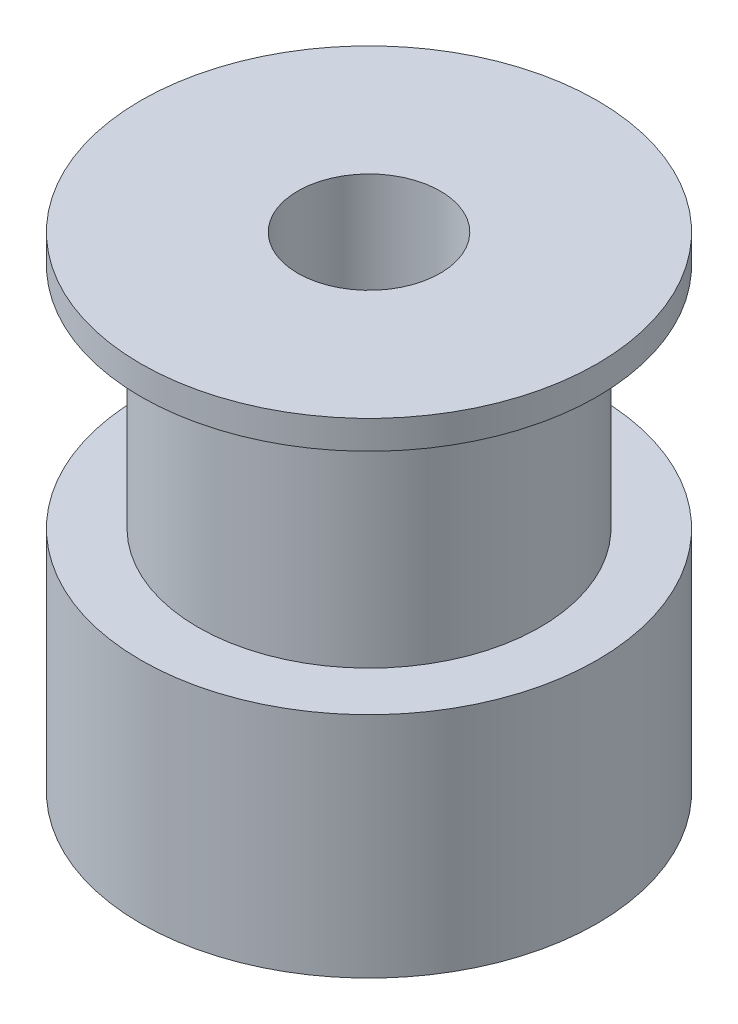
ISO-10303-21;
HEADER;
FILE_DESCRIPTION(('STEP AP214'),'2;1');
FILE_NAME('part.step','',(''),(''),'','','');
FILE_SCHEMA(('AUTOMOTIVE_DESIGN { 1 0 10303 214 1 1 1 1 }'));
ENDSEC;
DATA;
#1=APPLICATION_CONTEXT('core data for automotive mechanical design processes');
#2=APPLICATION_PROTOCOL_DEFINITION('international standard','automotive_design',2000,#1);
#3=PRODUCT_CONTEXT('',#1,'mechanical');
#4=PRODUCT('Part','Part','',(#3));
#5=PRODUCT_RELATED_PRODUCT_CATEGORY('part','',(#4));
#6=PRODUCT_DEFINITION_FORMATION('','',#4);
#7=PRODUCT_DEFINITION_CONTEXT('part definition',#1,'design');
#8=PRODUCT_DEFINITION('design','',#6,#7);
#9=PRODUCT_DEFINITION_SHAPE('','',#8);
#10=(LENGTH_UNIT() NAMED_UNIT(*) SI_UNIT(.MILLI.,.METRE.));
#11=(NAMED_UNIT(*) PLANE_ANGLE_UNIT() SI_UNIT($,.RADIAN.));
#12=(NAMED_UNIT(*) SI_UNIT($,.STERADIAN.) SOLID_ANGLE_UNIT());
#13=UNCERTAINTY_MEASURE_WITH_UNIT(LENGTH_MEASURE(1.E-05),#10,'distance_accuracy_value','');
#14=(GEOMETRIC_REPRESENTATION_CONTEXT(3) GLOBAL_UNCERTAINTY_ASSIGNED_CONTEXT((#13)) GLOBAL_UNIT_ASSIGNED_CONTEXT((#10,
#11,#12)) REPRESENTATION_CONTEXT('',''));
#15=CARTESIAN_POINT('',(0.,0.,0.));
#16=DIRECTION('',(0.,0.,1.));
#17=DIRECTION('',(1.,0.,0.));
#18=AXIS2_PLACEMENT_3D('',#15,#16,#17);
#19=CARTESIAN_POINT('',(0.,8.,0.));
#20=DIRECTION('',(0.,-1.,0.));
#21=DIRECTION('',(0.,0.,-1.));
#22=AXIS2_PLACEMENT_3D('',#19,#20,#21);
#23=CYLINDRICAL_SURFACE('',#22,8.);
#24=CARTESIAN_POINT('',(0.,8.,0.));
#25=DIRECTION('',(0.,1.,0.));
#26=DIRECTION('',(0.,0.,1.));
#27=AXIS2_PLACEMENT_3D('',#24,#25,#26);
#28=CIRCLE('',#27,8.);
#29=CARTESIAN_POINT('',(0.,8.,8.));
#30=VERTEX_POINT('',#29);
#31=EDGE_CURVE('E42',#30,#30,#28,.T.);
#32=ORIENTED_EDGE('',*,*,#31,.F.);
#33=EDGE_LOOP('',(#32));
#34=FACE_BOUND('',#33,.T.);
#35=CARTESIAN_POINT('',(0.,0.,0.));
#36=DIRECTION('',(0.,1.,0.));
#37=DIRECTION('',(0.,0.,1.));
#38=AXIS2_PLACEMENT_3D('',#35,#36,#37);
#39=CIRCLE('',#38,8.);
#40=CARTESIAN_POINT('',(0.,0.,8.));
#41=VERTEX_POINT('',#40);
#42=EDGE_CURVE('E38',#41,#41,#39,.T.);
#43=ORIENTED_EDGE('',*,*,#42,.T.);
#44=EDGE_LOOP('',(#43));
#45=FACE_BOUND('',#44,.T.);
#46=ADVANCED_FACE('F35',(#34,#45),#23,.T.);
#47=CARTESIAN_POINT('',(0.,8.,0.));
#48=DIRECTION('',(0.,1.,0.));
#49=DIRECTION('',(0.,0.,1.));
#50=AXIS2_PLACEMENT_3D('',#47,#48,#49);
#51=PLANE('',#50);
#52=CARTESIAN_POINT('',(0.,8.,0.));
#53=DIRECTION('',(0.,1.,0.));
#54=DIRECTION('',(0.,0.,1.));
#55=AXIS2_PLACEMENT_3D('',#52,#53,#54);
#56=CIRCLE('',#55,6.);
#57=CARTESIAN_POINT('',(0.,8.,6.));
#58=VERTEX_POINT('',#57);
#59=EDGE_CURVE('E10',#58,#58,#56,.T.);
#60=ORIENTED_EDGE('',*,*,#59,.F.);
#61=EDGE_LOOP('',(#60));
#62=FACE_BOUND('',#61,.T.);
#63=ORIENTED_EDGE('',*,*,#31,.T.);
#64=EDGE_LOOP('',(#63));
#65=FACE_BOUND('',#64,.T.);
#66=ADVANCED_FACE('F93',(#62,#65),#51,.T.);
#67=CARTESIAN_POINT('',(0.,0.,0.));
#68=DIRECTION('',(0.,1.,0.));
#69=DIRECTION('',(0.,0.,1.));
#70=AXIS2_PLACEMENT_3D('',#67,#68,#69);
#71=PLANE('',#70);
#72=CARTESIAN_POINT('',(0.,0.,0.));
#73=DIRECTION('',(0.,1.,0.));
#74=DIRECTION('',(0.,0.,1.));
#75=AXIS2_PLACEMENT_3D('',#72,#73,#74);
#76=CIRCLE('',#75,2.5);
#77=CARTESIAN_POINT('',(0.,0.,2.5));
#78=VERTEX_POINT('',#77);
#79=EDGE_CURVE('E55',#78,#78,#76,.T.);
#80=ORIENTED_EDGE('',*,*,#79,.T.);
#81=EDGE_LOOP('',(#80));
#82=FACE_BOUND('',#81,.T.);
#83=ORIENTED_EDGE('',*,*,#42,.F.);
#84=EDGE_LOOP('',(#83));
#85=FACE_BOUND('',#84,.T.);
#86=ADVANCED_FACE('F64',(#82,#85),#71,.F.);
#87=CARTESIAN_POINT('',(0.,16.,0.));
#88=DIRECTION('',(0.,-1.,0.));
#89=DIRECTION('',(0.,0.,-1.));
#90=AXIS2_PLACEMENT_3D('',#87,#88,#89);
#91=CYLINDRICAL_SURFACE('',#90,6.);
#92=CARTESIAN_POINT('',(0.,16.,0.));
#93=DIRECTION('',(0.,1.,0.));
#94=DIRECTION('',(0.,0.,1.));
#95=AXIS2_PLACEMENT_3D('',#92,#93,#94);
#96=CIRCLE('',#95,6.);
#97=CARTESIAN_POINT('',(0.,16.,6.));
#98=VERTEX_POINT('',#97);
#99=EDGE_CURVE('E48',#98,#98,#96,.T.);
#100=ORIENTED_EDGE('',*,*,#99,.F.);
#101=EDGE_LOOP('',(#100));
#102=FACE_BOUND('',#101,.T.);
#103=ORIENTED_EDGE('',*,*,#59,.T.);
#104=EDGE_LOOP('',(#103));
#105=FACE_BOUND('',#104,.T.);
#106=ADVANCED_FACE('F83',(#102,#105),#91,.T.);
#107=CARTESIAN_POINT('',(0.,17.,0.));
#108=DIRECTION('',(0.,-1.,0.));
#109=DIRECTION('',(0.,0.,-1.));
#110=AXIS2_PLACEMENT_3D('',#107,#108,#109);
#111=CYLINDRICAL_SURFACE('',#110,8.);
#112=CARTESIAN_POINT('',(0.,17.,0.));
#113=DIRECTION('',(0.,1.,0.));
#114=DIRECTION('',(0.,0.,1.));
#115=AXIS2_PLACEMENT_3D('',#112,#113,#114);
#116=CIRCLE('',#115,8.);
#117=CARTESIAN_POINT('',(0.,17.,8.));
#118=VERTEX_POINT('',#117);
#119=EDGE_CURVE('E51',#118,#118,#116,.T.);
#120=ORIENTED_EDGE('',*,*,#119,.F.);
#121=EDGE_LOOP('',(#120));
#122=FACE_BOUND('',#121,.T.);
#123=CARTESIAN_POINT('',(0.,16.,0.));
#124=DIRECTION('',(0.,1.,0.));
#125=DIRECTION('',(0.,0.,1.));
#126=AXIS2_PLACEMENT_3D('',#123,#124,#125);
#127=CIRCLE('',#126,8.);
#128=CARTESIAN_POINT('',(0.,16.,8.));
#129=VERTEX_POINT('',#128);
#130=EDGE_CURVE('E52',#129,#129,#127,.T.);
#131=ORIENTED_EDGE('',*,*,#130,.T.);
#132=EDGE_LOOP('',(#131));
#133=FACE_BOUND('',#132,.T.);
#134=ADVANCED_FACE('F77',(#122,#133),#111,.T.);
#135=CARTESIAN_POINT('',(0.,17.,0.));
#136=DIRECTION('',(0.,1.,0.));
#137=DIRECTION('',(0.,0.,1.));
#138=AXIS2_PLACEMENT_3D('',#135,#136,#137);
#139=PLANE('',#138);
#140=CARTESIAN_POINT('',(0.,17.,0.));
#141=DIRECTION('',(0.,1.,0.));
#142=DIRECTION('',(0.,0.,1.));
#143=AXIS2_PLACEMENT_3D('',#140,#141,#142);
#144=CIRCLE('',#143,2.5);
#145=CARTESIAN_POINT('',(0.,17.,2.5));
#146=VERTEX_POINT('',#145);
#147=EDGE_CURVE('E58',#146,#146,#144,.T.);
#148=ORIENTED_EDGE('',*,*,#147,.F.);
#149=EDGE_LOOP('',(#148));
#150=FACE_BOUND('',#149,.T.);
#151=ORIENTED_EDGE('',*,*,#119,.T.);
#152=EDGE_LOOP('',(#151));
#153=FACE_BOUND('',#152,.T.);
#154=ADVANCED_FACE('F74',(#150,#153),#139,.T.);
#155=CARTESIAN_POINT('',(0.,16.,0.));
#156=DIRECTION('',(0.,1.,0.));
#157=DIRECTION('',(0.,0.,1.));
#158=AXIS2_PLACEMENT_3D('',#155,#156,#157);
#159=PLANE('',#158);
#160=ORIENTED_EDGE('',*,*,#99,.T.);
#161=EDGE_LOOP('',(#160));
#162=FACE_BOUND('',#161,.T.);
#163=ORIENTED_EDGE('',*,*,#130,.F.);
#164=EDGE_LOOP('',(#163));
#165=FACE_BOUND('',#164,.T.);
#166=ADVANCED_FACE('F70',(#162,#165),#159,.F.);
#167=CARTESIAN_POINT('',(0.,0.,0.));
#168=DIRECTION('',(0.,1.,0.));
#169=DIRECTION('',(0.,0.,1.));
#170=AXIS2_PLACEMENT_3D('',#167,#168,#169);
#171=CYLINDRICAL_SURFACE('',#170,2.5);
#172=ORIENTED_EDGE('',*,*,#79,.F.);
#173=EDGE_LOOP('',(#172));
#174=FACE_BOUND('',#173,.T.);
#175=ORIENTED_EDGE('',*,*,#147,.T.);
#176=EDGE_LOOP('',(#175));
#177=FACE_BOUND('',#176,.T.);
#178=ADVANCED_FACE('F67',(#174,#177),#171,.F.);
#179=CLOSED_SHELL('',(#46,#66,#86,#106,#134,#154,#166,#178));
#180=MANIFOLD_SOLID_BREP('B2',#179);
#181=ADVANCED_BREP_SHAPE_REPRESENTATION('',(#18,#180),#14);
#182=SHAPE_DEFINITION_REPRESENTATION(#9,#181);
ENDSEC;
END-ISO-10303-21;
